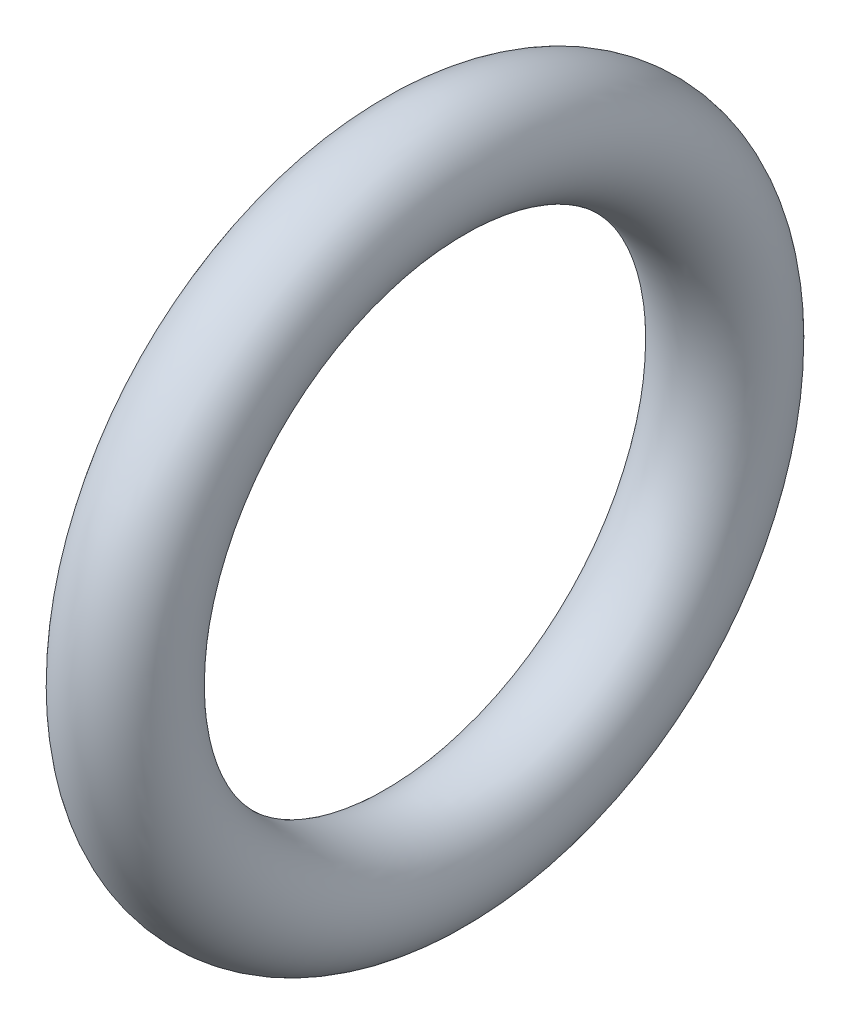
ISO-10303-21;
HEADER;
FILE_DESCRIPTION(('STEP AP214'),'2;1');
FILE_NAME('part.step','',(''),(''),'','','');
FILE_SCHEMA(('AUTOMOTIVE_DESIGN { 1 0 10303 214 1 1 1 1 }'));
ENDSEC;
DATA;
#1=APPLICATION_CONTEXT('core data for automotive mechanical design processes');
#2=APPLICATION_PROTOCOL_DEFINITION('international standard','automotive_design',2000,#1);
#3=PRODUCT_CONTEXT('',#1,'mechanical');
#4=PRODUCT('Part','Part','',(#3));
#5=PRODUCT_RELATED_PRODUCT_CATEGORY('part','',(#4));
#6=PRODUCT_DEFINITION_FORMATION('','',#4);
#7=PRODUCT_DEFINITION_CONTEXT('part definition',#1,'design');
#8=PRODUCT_DEFINITION('design','',#6,#7);
#9=PRODUCT_DEFINITION_SHAPE('','',#8);
#10=(LENGTH_UNIT() NAMED_UNIT(*) SI_UNIT(.MILLI.,.METRE.));
#11=(NAMED_UNIT(*) PLANE_ANGLE_UNIT() SI_UNIT($,.RADIAN.));
#12=(NAMED_UNIT(*) SI_UNIT($,.STERADIAN.) SOLID_ANGLE_UNIT());
#13=UNCERTAINTY_MEASURE_WITH_UNIT(LENGTH_MEASURE(1.E-05),#10,'distance_accuracy_value','');
#14=(GEOMETRIC_REPRESENTATION_CONTEXT(3) GLOBAL_UNCERTAINTY_ASSIGNED_CONTEXT((#13)) GLOBAL_UNIT_ASSIGNED_CONTEXT((#10,
#11,#12)) REPRESENTATION_CONTEXT('',''));
#15=CARTESIAN_POINT('',(0.,0.,0.));
#16=DIRECTION('',(0.,0.,1.));
#17=DIRECTION('',(1.,0.,0.));
#18=AXIS2_PLACEMENT_3D('',#15,#16,#17);
#19=CARTESIAN_POINT('',(17.2172805566573,5.52731908628917,0.));
#20=DIRECTION('',(1.,0.,0.));
#21=DIRECTION('',(0.,0.,-1.));
#22=AXIS2_PLACEMENT_3D('',#19,#20,#21);
#23=TOROIDAL_SURFACE('',#22,4.7625,0.889);
#24=ADVANCED_FACE('F14',(),#23,.T.);
#25=CLOSED_SHELL('',(#24));
#26=MANIFOLD_SOLID_BREP('B1',#25);
#27=ADVANCED_BREP_SHAPE_REPRESENTATION('',(#18,#26),#14);
#28=SHAPE_DEFINITION_REPRESENTATION(#9,#27);
ENDSEC;
END-ISO-10303-21;
